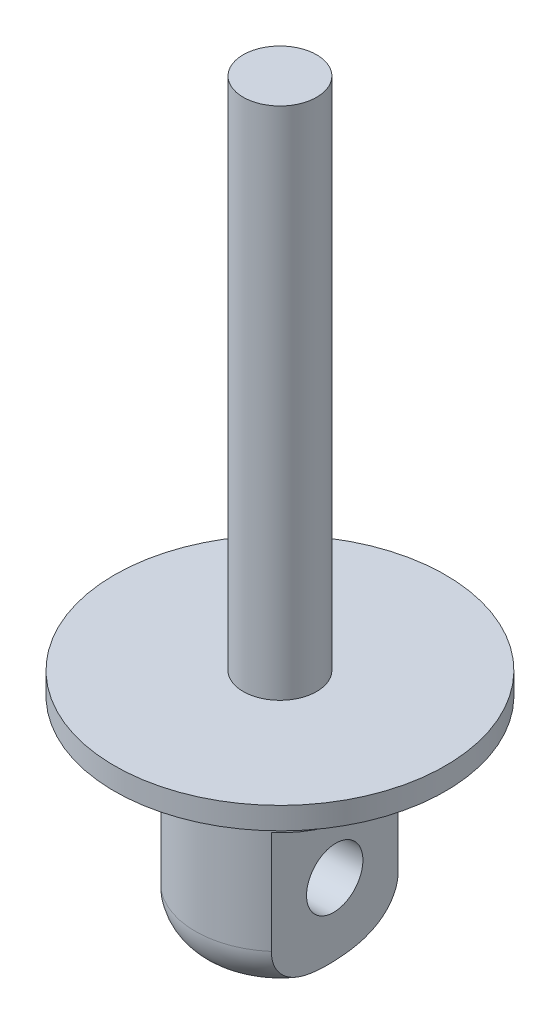
ISO-10303-21;
HEADER;
FILE_DESCRIPTION(('STEP AP214'),'2;1');
FILE_NAME('part.step','',(''),(''),'','','');
FILE_SCHEMA(('AUTOMOTIVE_DESIGN { 1 0 10303 214 1 1 1 1 }'));
ENDSEC;
DATA;
#1=APPLICATION_CONTEXT('core data for automotive mechanical design processes');
#2=APPLICATION_PROTOCOL_DEFINITION('international standard','automotive_design',2000,#1);
#3=PRODUCT_CONTEXT('',#1,'mechanical');
#4=PRODUCT('Part','Part','',(#3));
#5=PRODUCT_RELATED_PRODUCT_CATEGORY('part','',(#4));
#6=PRODUCT_DEFINITION_FORMATION('','',#4);
#7=PRODUCT_DEFINITION_CONTEXT('part definition',#1,'design');
#8=PRODUCT_DEFINITION('design','',#6,#7);
#9=PRODUCT_DEFINITION_SHAPE('','',#8);
#10=(LENGTH_UNIT() NAMED_UNIT(*) SI_UNIT(.MILLI.,.METRE.));
#11=(NAMED_UNIT(*) PLANE_ANGLE_UNIT() SI_UNIT($,.RADIAN.));
#12=(NAMED_UNIT(*) SI_UNIT($,.STERADIAN.) SOLID_ANGLE_UNIT());
#13=UNCERTAINTY_MEASURE_WITH_UNIT(LENGTH_MEASURE(1.E-05),#10,'distance_accuracy_value','');
#14=(GEOMETRIC_REPRESENTATION_CONTEXT(3) GLOBAL_UNCERTAINTY_ASSIGNED_CONTEXT((#13)) GLOBAL_UNIT_ASSIGNED_CONTEXT((#10,
#11,#12)) REPRESENTATION_CONTEXT('',''));
#15=CARTESIAN_POINT('',(0.,0.,0.));
#16=DIRECTION('',(0.,0.,1.));
#17=DIRECTION('',(1.,0.,0.));
#18=AXIS2_PLACEMENT_3D('',#15,#16,#17);
#19=CARTESIAN_POINT('',(0.,0.,0.));
#20=DIRECTION('',(0.,1.,0.));
#21=DIRECTION('',(-1.,0.,0.));
#22=AXIS2_PLACEMENT_3D('',#19,#20,#21);
#23=PLANE('',#22);
#24=CARTESIAN_POINT('',(0.,0.,0.));
#25=DIRECTION('',(0.,1.,0.));
#26=DIRECTION('',(-1.,0.,0.));
#27=AXIS2_PLACEMENT_3D('',#24,#25,#26);
#28=CIRCLE('',#27,5.5);
#29=CARTESIAN_POINT('',(-5.5,0.,0.));
#30=VERTEX_POINT('',#29);
#31=EDGE_CURVE('E123',#30,#30,#28,.F.);
#32=ORIENTED_EDGE('',*,*,#31,.T.);
#33=EDGE_LOOP('',(#32));
#34=FACE_BOUND('',#33,.T.);
#35=ADVANCED_FACE('F39',(#34),#23,.F.);
#36=CARTESIAN_POINT('',(0.,101.,0.));
#37=DIRECTION('',(0.,1.,0.));
#38=DIRECTION('',(-1.,0.,0.));
#39=AXIS2_PLACEMENT_3D('',#36,#37,#38);
#40=CYLINDRICAL_SURFACE('',#39,11.5);
#41=CARTESIAN_POINT('',(0.,6.00000000000001,0.));
#42=DIRECTION('',(0.,1.,0.));
#43=DIRECTION('',(-1.,0.,0.));
#44=AXIS2_PLACEMENT_3D('',#41,#42,#43);
#45=CIRCLE('',#44,11.5);
#46=CARTESIAN_POINT('',(6.79068463688067,6.00000000000001,-9.28098066814239));
#47=VERTEX_POINT('',#46);
#48=CARTESIAN_POINT('',(-7.16431353534802,6.00000000000001,-8.99569961521777));
#49=VERTEX_POINT('',#48);
#50=EDGE_CURVE('E121',#47,#49,#45,.T.);
#51=ORIENTED_EDGE('',*,*,#50,.T.);
#52=DIRECTION('',(0.,1.,0.));
#53=VECTOR('',#52,1.);
#54=CARTESIAN_POINT('',(-7.16431353534802,101.,-8.99569961521777));
#55=LINE('',#54,#53);
#56=CARTESIAN_POINT('',(-7.16431353534802,20.,-8.99569961521777));
#57=VERTEX_POINT('',#56);
#58=EDGE_CURVE('E56',#49,#57,#55,.T.);
#59=ORIENTED_EDGE('',*,*,#58,.T.);
#60=CARTESIAN_POINT('',(0.,20.,0.));
#61=DIRECTION('',(0.,-1.,0.));
#62=DIRECTION('',(1.,0.,0.));
#63=AXIS2_PLACEMENT_3D('',#60,#61,#62);
#64=CIRCLE('',#63,11.5);
#65=CARTESIAN_POINT('',(-7.16431353534802,20.,8.99569961521777));
#66=VERTEX_POINT('',#65);
#67=EDGE_CURVE('E11',#66,#57,#64,.T.);
#68=ORIENTED_EDGE('',*,*,#67,.F.);
#69=DIRECTION('',(0.,1.,0.));
#70=VECTOR('',#69,1.);
#71=CARTESIAN_POINT('',(-7.16431353534803,101.,8.99569961521777));
#72=LINE('',#71,#70);
#73=CARTESIAN_POINT('',(-7.16431353534802,6.00000000000118,8.99569961521845));
#74=VERTEX_POINT('',#73);
#75=EDGE_CURVE('E100',#66,#74,#72,.F.);
#76=ORIENTED_EDGE('',*,*,#75,.T.);
#77=CARTESIAN_POINT('',(7.52597118644042,6.00000000000001,8.69538715071782));
#78=VERTEX_POINT('',#77);
#79=EDGE_CURVE('E99',#74,#78,#45,.T.);
#80=ORIENTED_EDGE('',*,*,#79,.T.);
#81=DIRECTION('',(0.,1.,0.));
#82=VECTOR('',#81,1.);
#83=CARTESIAN_POINT('',(7.52597118644042,101.,8.69538715071782));
#84=LINE('',#83,#82);
#85=CARTESIAN_POINT('',(7.52597118644042,20.,8.69538715071782));
#86=VERTEX_POINT('',#85);
#87=EDGE_CURVE('E64',#78,#86,#84,.T.);
#88=ORIENTED_EDGE('',*,*,#87,.T.);
#89=CARTESIAN_POINT('',(0.,20.,0.));
#90=DIRECTION('',(0.,-1.,0.));
#91=DIRECTION('',(1.,0.,0.));
#92=AXIS2_PLACEMENT_3D('',#89,#90,#91);
#93=CIRCLE('',#92,11.5);
#94=CARTESIAN_POINT('',(6.79068463688067,20.,-9.28098066814239));
#95=VERTEX_POINT('',#94);
#96=EDGE_CURVE('E49',#95,#86,#93,.T.);
#97=ORIENTED_EDGE('',*,*,#96,.F.);
#98=DIRECTION('',(0.,1.,0.));
#99=VECTOR('',#98,1.);
#100=CARTESIAN_POINT('',(6.79068463688067,101.,-9.28098066814239));
#101=LINE('',#100,#99);
#102=EDGE_CURVE('E90',#95,#47,#101,.F.);
#103=ORIENTED_EDGE('',*,*,#102,.T.);
#104=EDGE_LOOP('',(#51,#59,#68,#76,#80,#88,#97,#103));
#105=FACE_BOUND('',#104,.T.);
#106=CARTESIAN_POINT('',(0.,28.,0.));
#107=DIRECTION('',(0.,1.,0.));
#108=DIRECTION('',(-1.,0.,0.));
#109=AXIS2_PLACEMENT_3D('',#106,#107,#108);
#110=CIRCLE('',#109,11.5);
#111=CARTESIAN_POINT('',(-11.5,28.,0.));
#112=VERTEX_POINT('',#111);
#113=EDGE_CURVE('E118',#112,#112,#110,.T.);
#114=ORIENTED_EDGE('',*,*,#113,.F.);
#115=EDGE_LOOP('',(#114));
#116=FACE_BOUND('',#115,.T.);
#117=ADVANCED_FACE('F95',(#105,#116),#40,.T.);
#118=CARTESIAN_POINT('',(11.5,28.,0.));
#119=DIRECTION('',(0.,1.,0.));
#120=DIRECTION('',(-1.,0.,0.));
#121=AXIS2_PLACEMENT_3D('',#118,#119,#120);
#122=PLANE('',#121);
#123=CARTESIAN_POINT('',(0.,28.,0.));
#124=DIRECTION('',(0.,1.,0.));
#125=DIRECTION('',(-1.,0.,0.));
#126=AXIS2_PLACEMENT_3D('',#123,#124,#125);
#127=CIRCLE('',#126,22.5);
#128=CARTESIAN_POINT('',(-22.5,28.,0.));
#129=VERTEX_POINT('',#128);
#130=EDGE_CURVE('E115',#129,#129,#127,.T.);
#131=ORIENTED_EDGE('',*,*,#130,.F.);
#132=EDGE_LOOP('',(#131));
#133=FACE_BOUND('',#132,.T.);
#134=ORIENTED_EDGE('',*,*,#113,.T.);
#135=EDGE_LOOP('',(#134));
#136=FACE_BOUND('',#135,.T.);
#137=ADVANCED_FACE('F162',(#133,#136),#122,.F.);
#138=CARTESIAN_POINT('',(0.,101.,0.));
#139=DIRECTION('',(0.,1.,0.));
#140=DIRECTION('',(-1.,0.,0.));
#141=AXIS2_PLACEMENT_3D('',#138,#139,#140);
#142=CYLINDRICAL_SURFACE('',#141,22.5);
#143=CARTESIAN_POINT('',(0.,31.,0.));
#144=DIRECTION('',(0.,1.,0.));
#145=DIRECTION('',(-1.,0.,0.));
#146=AXIS2_PLACEMENT_3D('',#143,#144,#145);
#147=CIRCLE('',#146,22.5);
#148=CARTESIAN_POINT('',(-22.5,31.,0.));
#149=VERTEX_POINT('',#148);
#150=EDGE_CURVE('E112',#149,#149,#147,.T.);
#151=ORIENTED_EDGE('',*,*,#150,.F.);
#152=EDGE_LOOP('',(#151));
#153=FACE_BOUND('',#152,.T.);
#154=ORIENTED_EDGE('',*,*,#130,.T.);
#155=EDGE_LOOP('',(#154));
#156=FACE_BOUND('',#155,.T.);
#157=ADVANCED_FACE('F158',(#153,#156),#142,.T.);
#158=CARTESIAN_POINT('',(22.5,31.,0.));
#159=DIRECTION('',(0.,-1.,0.));
#160=DIRECTION('',(1.,0.,0.));
#161=AXIS2_PLACEMENT_3D('',#158,#159,#160);
#162=PLANE('',#161);
#163=CARTESIAN_POINT('',(0.,31.,0.));
#164=DIRECTION('',(0.,1.,0.));
#165=DIRECTION('',(-1.,0.,0.));
#166=AXIS2_PLACEMENT_3D('',#163,#164,#165);
#167=CIRCLE('',#166,5.);
#168=CARTESIAN_POINT('',(-5.,31.,0.));
#169=VERTEX_POINT('',#168);
#170=EDGE_CURVE('E109',#169,#169,#167,.T.);
#171=ORIENTED_EDGE('',*,*,#170,.F.);
#172=EDGE_LOOP('',(#171));
#173=FACE_BOUND('',#172,.T.);
#174=ORIENTED_EDGE('',*,*,#150,.T.);
#175=EDGE_LOOP('',(#174));
#176=FACE_BOUND('',#175,.T.);
#177=ADVANCED_FACE('F154',(#173,#176),#162,.F.);
#178=CARTESIAN_POINT('',(0.,101.,0.));
#179=DIRECTION('',(0.,1.,0.));
#180=DIRECTION('',(-1.,0.,0.));
#181=AXIS2_PLACEMENT_3D('',#178,#179,#180);
#182=CYLINDRICAL_SURFACE('',#181,5.);
#183=CARTESIAN_POINT('',(0.,101.,0.));
#184=DIRECTION('',(0.,1.,0.));
#185=DIRECTION('',(-1.,0.,0.));
#186=AXIS2_PLACEMENT_3D('',#183,#184,#185);
#187=CIRCLE('',#186,5.);
#188=CARTESIAN_POINT('',(-5.,101.,0.));
#189=VERTEX_POINT('',#188);
#190=EDGE_CURVE('E106',#189,#189,#187,.T.);
#191=ORIENTED_EDGE('',*,*,#190,.F.);
#192=EDGE_LOOP('',(#191));
#193=FACE_BOUND('',#192,.T.);
#194=ORIENTED_EDGE('',*,*,#170,.T.);
#195=EDGE_LOOP('',(#194));
#196=FACE_BOUND('',#195,.T.);
#197=ADVANCED_FACE('F150',(#193,#196),#182,.T.);
#198=CARTESIAN_POINT('',(5.,101.,0.));
#199=DIRECTION('',(0.,-1.,0.));
#200=DIRECTION('',(1.,0.,0.));
#201=AXIS2_PLACEMENT_3D('',#198,#199,#200);
#202=PLANE('',#201);
#203=ORIENTED_EDGE('',*,*,#190,.T.);
#204=EDGE_LOOP('',(#203));
#205=FACE_BOUND('',#204,.T.);
#206=ADVANCED_FACE('F147',(#205),#202,.F.);
#207=CARTESIAN_POINT('',(0.,6.00000000000001,0.));
#208=DIRECTION('',(0.,1.,0.));
#209=DIRECTION('',(-1.,0.,0.));
#210=AXIS2_PLACEMENT_3D('',#207,#208,#209);
#211=DEGENERATE_TOROIDAL_SURFACE('',#210,5.5,6.,.T.);
#212=CARTESIAN_POINT('',(-7.16431353534802,0.235447939687133,0.));
#213=CARTESIAN_POINT('',(-7.16431353534802,0.235447385437466,0.181491533136056));
#214=CARTESIAN_POINT('',(-7.16431353534802,0.23742869346163,0.362983746875409));
#215=CARTESIAN_POINT('',(-7.16431353534802,0.245475154346559,0.725880113997458));
#216=CARTESIAN_POINT('',(-7.16431353534802,0.251540333582035,0.907284266803863));
#217=CARTESIAN_POINT('',(-7.16431353534802,0.268118020232585,1.26996799012435));
#218=CARTESIAN_POINT('',(-7.16431353534802,0.278632341374094,1.45124747959771));
#219=CARTESIAN_POINT('',(-7.16431353534802,0.304680550331587,1.81344970591921));
#220=CARTESIAN_POINT('',(-7.16431353534802,0.320214442367016,1.99437244246734));
#221=CARTESIAN_POINT('',(-7.16431353534802,0.356966363231156,2.35479167624498));
#222=CARTESIAN_POINT('',(-7.16431353534802,0.378157142833225,2.5342908710497));
#223=CARTESIAN_POINT('',(-7.16431353534802,0.427119188386968,2.89237794599804));
#224=CARTESIAN_POINT('',(-7.16431353534802,0.454890723675215,3.07096578853624));
#225=CARTESIAN_POINT('',(-7.16431353534802,0.549469182140893,3.60446596488215));
#226=CARTESIAN_POINT('',(-7.16431353534802,0.627581457208977,3.95757039707788));
#227=CARTESIAN_POINT('',(-7.16431353534802,0.775834743875251,4.48875396104387));
#228=CARTESIAN_POINT('',(-7.16431353534802,0.832300014805054,4.67069228400975));
#229=CARTESIAN_POINT('',(-7.16431353534802,0.956848351976338,5.03052555040747));
#230=CARTESIAN_POINT('',(-7.16431353534802,1.0249274368938,5.20842185587686));
#231=CARTESIAN_POINT('',(-7.16431353534802,1.17373125438983,5.55909121632505));
#232=CARTESIAN_POINT('',(-7.16431353534802,1.25446887709604,5.7318588331293));
#233=CARTESIAN_POINT('',(-7.16431353534802,1.42925025676239,6.07046753475876));
#234=CARTESIAN_POINT('',(-7.16431353534802,1.52328798021666,6.23631171641432));
#235=CARTESIAN_POINT('',(-7.16431353534802,1.72651877943088,6.56153147369497));
#236=CARTESIAN_POINT('',(-7.16431353534802,1.83589496222493,6.72079324457046));
#237=CARTESIAN_POINT('',(-7.16431353534802,2.0689448895318,7.02839097103782));
#238=CARTESIAN_POINT('',(-7.16431353534802,2.19261047974076,7.17673307962208));
#239=CARTESIAN_POINT('',(-7.16431353534802,2.45394010435715,7.4602966623001));
#240=CARTESIAN_POINT('',(-7.16431353534802,2.59158864400725,7.59553234192747));
#241=CARTESIAN_POINT('',(-7.16431353534802,2.88022257546079,7.85079414311618));
#242=CARTESIAN_POINT('',(-7.16431353534802,3.03120259547424,7.97082634373662));
#243=CARTESIAN_POINT('',(-7.16431353534802,3.41572240607048,8.24335534466075));
#244=CARTESIAN_POINT('',(-7.16431353534802,3.65605567979531,8.38646099725246));
#245=CARTESIAN_POINT('',(-7.16431353534802,4.1572090343419,8.6303675341194));
#246=CARTESIAN_POINT('',(-7.16431353534802,4.4180187857083,8.73118958782459));
#247=CARTESIAN_POINT('',(-7.16431353534802,4.95401771715259,8.88629598199798));
#248=CARTESIAN_POINT('',(-7.16431353534802,5.22924501268925,8.94044959895495));
#249=CARTESIAN_POINT('',(-7.16431353534802,5.78496311966398,8.99906960316239));
#250=CARTESIAN_POINT('',(-7.16431353534802,6.06545356225002,9.00353945942055));
#251=CARTESIAN_POINT('',(-7.16431353534802,6.60884633031526,8.96362522979109));
#252=CARTESIAN_POINT('',(-7.16431353534802,6.8719301139816,8.92165736558809));
#253=CARTESIAN_POINT('',(-7.16431353534802,7.38737416990948,8.79456934169308));
#254=CARTESIAN_POINT('',(-7.16431353534802,7.63973586248513,8.70945491689695));
#255=CARTESIAN_POINT('',(-7.16431353534802,8.12994286336459,8.49855003256806));
#256=CARTESIAN_POINT('',(-7.16431353534802,8.36760520889661,8.37233653564602));
#257=CARTESIAN_POINT('',(-7.16431353534802,8.82038173170156,8.08451113210159));
#258=CARTESIAN_POINT('',(-7.16431353534802,9.03548777706986,7.92288652364278));
#259=CARTESIAN_POINT('',(-7.16431353534802,9.45549671439815,7.55621948202331));
#260=CARTESIAN_POINT('',(-7.16431353534802,9.65828949594099,7.34877147399991));
#261=CARTESIAN_POINT('',(-7.16431353534802,10.0316637916763,6.90687485831092));
#262=CARTESIAN_POINT('',(-7.16431353534802,10.20224328937,6.67242456182436));
#263=CARTESIAN_POINT('',(-7.16431353534802,10.4730249195008,6.24423355588082));
#264=CARTESIAN_POINT('',(-7.16431353534802,10.5801901087915,6.05481229299179));
#265=CARTESIAN_POINT('',(-7.16431353534802,10.7772721256261,5.66712033210488));
#266=CARTESIAN_POINT('',(-7.16431353534802,10.8671811478653,5.46884567929057));
#267=CARTESIAN_POINT('',(-7.16431353534802,11.0310002099733,5.06537873875574));
#268=CARTESIAN_POINT('',(-7.16431353534802,11.1048765511754,4.86017290833698));
#269=CARTESIAN_POINT('',(-7.16431353534802,11.2379136118252,4.44499628803238));
#270=CARTESIAN_POINT('',(-7.16431353534802,11.2970681434875,4.23502353486677));
#271=CARTESIAN_POINT('',(-7.16431353534802,11.398755554638,3.82610383992846));
#272=CARTESIAN_POINT('',(-7.16431353534802,11.4421388005837,3.62736520690331));
#273=CARTESIAN_POINT('',(-7.16431353534802,11.518936312589,3.22802526364301));
#274=CARTESIAN_POINT('',(-7.16431353534802,11.5523520822801,3.02742423906925));
#275=CARTESIAN_POINT('',(-7.16431353534802,11.6106398137743,2.6247491097359));
#276=CARTESIAN_POINT('',(-7.16431353534802,11.6355010304291,2.42267347558179));
#277=CARTESIAN_POINT('',(-7.16431353534802,11.677889372671,2.01775837249206));
#278=CARTESIAN_POINT('',(-7.16431353534802,11.6954161180065,1.81491886450376));
#279=CARTESIAN_POINT('',(-7.16431353534802,11.7242542262342,1.40798412413948));
#280=CARTESIAN_POINT('',(-7.16431353534802,11.7355401791264,1.20388713013457));
#281=CARTESIAN_POINT('',(-7.16431353534802,11.7525759351435,0.795479435638228));
#282=CARTESIAN_POINT('',(-7.16431353534802,11.758326043797,0.591168747563914));
#283=CARTESIAN_POINT('',(-7.16431353534802,11.7647302227779,0.182587956579615));
#284=CARTESIAN_POINT('',(-7.16431353534802,11.7653872640604,-0.0216821004740007));
#285=CARTESIAN_POINT('',(-7.16431353534802,11.7616579544952,-0.430176665338991));
#286=CARTESIAN_POINT('',(-7.16431353534802,11.7572715456939,-0.63440117259999));
#287=CARTESIAN_POINT('',(-7.16431353534802,11.7396547677781,-1.14344656238087));
#288=CARTESIAN_POINT('',(-7.16431353534802,11.7231276636045,-1.4481629037706));
#289=CARTESIAN_POINT('',(-7.16431353534802,11.6755572442818,-2.05645893586162));
#290=CARTESIAN_POINT('',(-7.16431353534802,11.6445175764183,-2.36003889284599));
#291=CARTESIAN_POINT('',(-7.16431353534802,11.5841838938663,-2.81291693878126));
#292=CARTESIAN_POINT('',(-7.16431353534802,11.5618394576941,-2.96314184070143));
#293=CARTESIAN_POINT('',(-7.16431353534802,11.5120049649201,-3.26271376257647));
#294=CARTESIAN_POINT('',(-7.16431353534802,11.4845153732607,-3.41206086059742));
#295=CARTESIAN_POINT('',(-7.16431353534802,11.3934679228193,-3.85825349555144));
#296=CARTESIAN_POINT('',(-7.16431353534802,11.3213055413641,-4.15345715800239));
#297=CARTESIAN_POINT('',(-7.16431353534802,11.1798345773387,-4.63280630857077));
#298=CARTESIAN_POINT('',(-7.16431353534802,11.1185312944909,-4.81932855329792));
#299=CARTESIAN_POINT('',(-7.16431353534802,10.9832814162456,-5.18771745074792));
#300=CARTESIAN_POINT('',(-7.16431353534802,10.9093387390841,-5.36958552624404));
#301=CARTESIAN_POINT('',(-7.16431353534802,10.7478263673606,-5.72720446263923));
#302=CARTESIAN_POINT('',(-7.16431353534802,10.6602564145626,-5.90295520753806));
#303=CARTESIAN_POINT('',(-7.16431353534802,10.4707641468701,-6.24655829644649));
#304=CARTESIAN_POINT('',(-7.16431353534802,10.3688446568602,-6.4144121863938));
#305=CARTESIAN_POINT('',(-7.16431353534802,10.1702027494497,-6.71049652924636));
#306=CARTESIAN_POINT('',(-7.16431353534802,10.0759249918341,-6.84036864299017));
#307=CARTESIAN_POINT('',(-7.16431353534802,9.87745005614956,-7.09235977997643));
#308=CARTESIAN_POINT('',(-7.16431353534802,9.77325150498626,-7.21447772608764));
#309=CARTESIAN_POINT('',(-7.16431353534802,9.55512025398443,-7.44967839091494));
#310=CARTESIAN_POINT('',(-7.16431353534802,9.44118890789524,-7.5627623619599));
#311=CARTESIAN_POINT('',(-7.16431353534802,9.20396341092919,-7.77863502919202));
#312=CARTESIAN_POINT('',(-7.16431353534802,9.0806705480437,-7.88142513714977));
#313=CARTESIAN_POINT('',(-7.16431353534802,8.8243231203039,-8.07621490572432));
#314=CARTESIAN_POINT('',(-7.16431353534802,8.69120113592203,-8.16812606994532));
#315=CARTESIAN_POINT('',(-7.16431353534802,8.4169431732426,-8.33896771972691));
#316=CARTESIAN_POINT('',(-7.16431353534802,8.27581104010527,-8.41790436379917));
#317=CARTESIAN_POINT('',(-7.16431353534802,7.98657177878401,-8.5617107546654));
#318=CARTESIAN_POINT('',(-7.16431353534802,7.83846588879299,-8.62658298722294));
#319=CARTESIAN_POINT('',(-7.16431353534802,7.53654671091518,-8.74129459696838));
#320=CARTESIAN_POINT('',(-7.16431353534802,7.38273424741489,-8.7911361361064));
#321=CARTESIAN_POINT('',(-7.16431353534802,7.09038243776846,-8.86976609906792));
#322=CARTESIAN_POINT('',(-7.16431353534802,6.95233887820745,-8.9004079832714));
#323=CARTESIAN_POINT('',(-7.16431353534802,6.67406773175886,-8.9492206879905));
#324=CARTESIAN_POINT('',(-7.16431353534802,6.53384034417802,-8.96739263983008));
#325=CARTESIAN_POINT('',(-7.16431353534802,6.25237333567887,-8.99103390570626));
#326=CARTESIAN_POINT('',(-7.16431353534802,6.11113412109898,-8.99650806046049));
#327=CARTESIAN_POINT('',(-7.16431353534802,5.8287378130908,-8.99469859065023));
#328=CARTESIAN_POINT('',(-7.16431353534802,5.68758071782573,-8.9874152633463));
#329=CARTESIAN_POINT('',(-7.16431353534802,5.41510706714754,-8.96101956781087));
#330=CARTESIAN_POINT('',(-7.16431353534802,5.2837170186452,-8.94265850596696));
#331=CARTESIAN_POINT('',(-7.16431353534802,5.02289842867066,-8.89497273577228));
#332=CARTESIAN_POINT('',(-7.16431353534802,4.89347053172236,-8.86564450280155));
#333=CARTESIAN_POINT('',(-7.16431353534802,4.63756174204751,-8.7963600511725));
#334=CARTESIAN_POINT('',(-7.16431353534802,4.51107947467129,-8.75640890261238));
#335=CARTESIAN_POINT('',(-7.16431353534802,4.26176585926293,-8.66628087540806));
#336=CARTESIAN_POINT('',(-7.16431353534802,4.13893590041353,-8.61610016146906));
#337=CARTESIAN_POINT('',(-7.16431353534802,3.8959444879985,-8.50522697244006));
#338=CARTESIAN_POINT('',(-7.16431353534802,3.7758480812018,-8.44439186082342));
#339=CARTESIAN_POINT('',(-7.16431353534802,3.54086616831137,-8.31334588199134));
#340=CARTESIAN_POINT('',(-7.16431353534802,3.42598255125706,-8.24313165170298));
#341=CARTESIAN_POINT('',(-7.16431353534802,3.09008987290001,-8.01943070900894));
#342=CARTESIAN_POINT('',(-7.16431353534802,2.87767005979279,-7.8528076878874));
#343=CARTESIAN_POINT('',(-7.16431353534802,2.46294682270087,-7.47564860292608));
#344=CARTESIAN_POINT('',(-7.16431353534802,2.26293630171616,-7.26261925849268));
#345=CARTESIAN_POINT('',(-7.16431353534802,1.89561646384311,-6.81009370640971));
#346=CARTESIAN_POINT('',(-7.16431353534802,1.72831789617765,-6.57058883917637));
#347=CARTESIAN_POINT('',(-7.16431353534802,1.46175526259968,-6.1311296182884));
#348=CARTESIAN_POINT('',(-7.16431353534802,1.35575306584162,-5.93518181859578));
#349=CARTESIAN_POINT('',(-7.16431353534802,1.16159753101357,-5.53455580746181));
#350=CARTESIAN_POINT('',(-7.16431353534802,1.07345243066623,-5.3298736191984));
#351=CARTESIAN_POINT('',(-7.16431353534802,0.913637776442995,-4.91388049225675));
#352=CARTESIAN_POINT('',(-7.16431353534802,0.841993844213501,-4.70255981630851));
#353=CARTESIAN_POINT('',(-7.16431353534802,0.713673352689305,-4.27539497429056));
#354=CARTESIAN_POINT('',(-7.16431353534802,0.657002251003379,-4.05954918967177));
#355=CARTESIAN_POINT('',(-7.16431353534802,0.534666060627862,-3.52868407160688));
#356=CARTESIAN_POINT('',(-7.16431353534802,0.476113772416793,-3.21203565818064));
#357=CARTESIAN_POINT('',(-7.16431353534802,0.380814152456521,-2.57546372196236));
#358=CARTESIAN_POINT('',(-7.16431353534802,0.344078082586474,-2.25553859420684));
#359=CARTESIAN_POINT('',(-7.16431353534802,0.30166577370918,-1.77408585021101));
#360=CARTESIAN_POINT('',(-7.16431353534802,0.289634376947914,-1.61307528362636));
#361=CARTESIAN_POINT('',(-7.16431353534802,0.269379560597742,-1.29081455353211));
#362=CARTESIAN_POINT('',(-7.16431353534802,0.261156074713451,-1.12956439424283));
#363=CARTESIAN_POINT('',(-7.16431353534802,0.248150357286316,-0.806958011139428));
#364=CARTESIAN_POINT('',(-7.16431353534802,0.243367511249777,-0.645601811419018));
#365=CARTESIAN_POINT('',(-7.16431353534802,0.237016584347217,-0.322830586335497));
#366=CARTESIAN_POINT('',(-7.16431353534802,0.235448432627603,-0.161415562347334));
#367=CARTESIAN_POINT('',(-7.16431353534802,0.235447939687133,0.));
#368=B_SPLINE_CURVE_WITH_KNOTS('',3,(#212,#213,#214,#215,#216,#217,#218,#219,#220,#221,#222,
#223,#224,#225,#226,#227,#228,#229,#230,#231,#232,#233,#234,#235,#236,#237,#238,#239,#240,#241,
#242,#243,#244,#245,#246,#247,#248,#249,#250,#251,#252,#253,#254,#255,#256,#257,#258,#259,#260,
#261,#262,#263,#264,#265,#266,#267,#268,#269,#270,#271,#272,#273,#274,#275,#276,#277,#278,#279,
#280,#281,#282,#283,#284,#285,#286,#287,#288,#289,#290,#291,#292,#293,#294,#295,#296,#297,#298,
#299,#300,#301,#302,#303,#304,#305,#306,#307,#308,#309,#310,#311,#312,#313,#314,#315,#316,#317,
#318,#319,#320,#321,#322,#323,#324,#325,#326,#327,#328,#329,#330,#331,#332,#333,#334,#335,#336,
#337,#338,#339,#340,#341,#342,#343,#344,#345,#346,#347,#348,#349,#350,#351,#352,#353,#354,#355,
#356,#357,#358,#359,#360,#361,#362,#363,#364,#365,#366,#367),.UNSPECIFIED.,.T.,.F.,(4,2,2,2,2,2,
2,2,2,2,2,2,2,2,2,2,2,2,2,2,2,2,2,2,2,2,2,2,2,2,2,2,2,2,2,2,2,2,2,2,2,2,2,2,2,2,2,2,2,2,2,2,2,2,
2,2,2,2,2,2,2,2,2,2,2,2,2,2,2,2,2,2,2,2,2,2,2,4),(0.,0.544464449306331,1.0889324149404,
1.63362255122444,2.17831314537551,2.72042588446775,3.26256081493455,4.34546196893951,
4.91664119834856,5.48762501421211,6.05919408229474,6.6305046884539,7.20933142540787,
7.78782946898906,8.36569332006232,8.94332537990972,9.7785351396075,10.6133262480286,
11.450448169105,12.2875116404871,13.0829865149816,13.8783556853407,14.6821851309487,
15.4863033806728,16.3532449460675,17.2202407626045,17.8722698845528,18.524593240656,
19.1782746963236,19.8322304413083,20.4422008385135,21.0520791727966,21.662720786447,
22.2733940545484,22.8865357673916,23.4996436384011,24.1123938363026,24.7251510752737,
25.6403741251082,26.5553672853633,27.0109164517383,27.4664244722302,28.3768166885084,
28.9654505855983,29.5539023349109,30.1423652367013,30.7307124538162,31.2117126051947,
31.6927794267792,32.173779444651,32.6547134042972,33.1393239388263,33.6237037786881,
34.1079979386687,34.5922224066056,35.0158852718248,35.4395096955088,35.8629725964132,
36.2864256303907,36.6839603487719,37.0816229364711,37.4790960676532,37.8767184954625,
38.2801401164505,38.6837067826903,39.4902880437004,40.3636355278285,41.2372695154174,
41.9047138520098,42.5724653921678,43.2412468749535,43.9102717938647,44.8752765764408,
45.8407790778015,46.3251223664607,46.8094572224297,47.293705555348,47.7779432150576),.UNSPECIFIED.);
#369=EDGE_CURVE('E87',#49,#74,#368,.T.);
#370=ORIENTED_EDGE('',*,*,#369,.F.);
#371=ORIENTED_EDGE('',*,*,#50,.F.);
#372=CARTESIAN_POINT('',(7.52597118626627,6.0002,8.69538714646008));
#373=CARTESIAN_POINT('',(7.52597248742701,5.86230001302887,8.69541895738338));
#374=CARTESIAN_POINT('',(7.52572333282544,5.72440781564216,8.68932759781188));
#375=CARTESIAN_POINT('',(7.52473190823925,5.44972511554161,8.6650891386197));
#376=CARTESIAN_POINT('',(7.52398977172153,5.31293432478202,8.64694530201296));
#377=CARTESIAN_POINT('',(7.52202406018518,5.04200071280883,8.59888736647145));
#378=CARTESIAN_POINT('',(7.52080239763859,4.90784956893259,8.56902002386722));
#379=CARTESIAN_POINT('',(7.51789213238698,4.64261531620105,8.49786953342967));
#380=CARTESIAN_POINT('',(7.51620351691006,4.51153229137004,8.45658607334752));
#381=CARTESIAN_POINT('',(7.51237996235273,4.25344311361428,8.36310738379537));
#382=CARTESIAN_POINT('',(7.51024536645261,4.1264339120807,8.31092054443568));
#383=CARTESIAN_POINT('',(7.50555163598325,3.8771508970323,8.19616769684145));
#384=CARTESIAN_POINT('',(7.50299233898037,3.75487891749852,8.13359771741079));
#385=CARTESIAN_POINT('',(7.49747634346094,3.51581215695569,7.99874204188718));
#386=CARTESIAN_POINT('',(7.49451959179049,3.39901811136557,7.92645504628117));
#387=CARTESIAN_POINT('',(7.48823740191234,3.17147362045055,7.7728673653628));
#388=CARTESIAN_POINT('',(7.48491182593279,3.06072545673246,7.69156331178813));
#389=CARTESIAN_POINT('',(7.47780151567229,2.84201467789877,7.51772965112143));
#390=CARTESIAN_POINT('',(7.4740047631842,2.73428622662628,7.42490622155672));
#391=CARTESIAN_POINT('',(7.46608515139464,2.52620232626834,7.23128666657228));
#392=CARTESIAN_POINT('',(7.46196216604259,2.42584975626469,7.13048745945412));
#393=CARTESIAN_POINT('',(7.45342716585144,2.23280439751209,6.92182281998527));
#394=CARTESIAN_POINT('',(7.44901514598233,2.14011174213041,6.81395726466052));
#395=CARTESIAN_POINT('',(7.43993695327578,1.96248922795767,6.5920125938092));
#396=CARTESIAN_POINT('',(7.43527072814072,1.87756097623446,6.4779321997048));
#397=CARTESIAN_POINT('',(7.42353388981518,1.67841601081936,6.19098866334225));
#398=CARTESIAN_POINT('',(7.41633917390523,1.56855596714217,6.01509144391563));
#399=CARTESIAN_POINT('',(7.40157902662615,1.36491448378602,5.65423371204458));
#400=CARTESIAN_POINT('',(7.39401345119571,1.27113935700065,5.46926967757344));
#401=CARTESIAN_POINT('',(7.37859545377025,1.09882125863757,5.09232875173138));
#402=CARTESIAN_POINT('',(7.37074290811495,1.02028494792898,4.90034883710009));
#403=CARTESIAN_POINT('',(7.35482413614809,0.877322588622236,4.51116491924908));
#404=CARTESIAN_POINT('',(7.34675780056869,0.812903917741998,4.31395824463694));
#405=CARTESIAN_POINT('',(7.32443911726661,0.653853584410808,3.76830857851557));
#406=CARTESIAN_POINT('',(7.31003109255367,0.572194827420425,3.41605957853299));
#407=CARTESIAN_POINT('',(7.28825224891788,0.4729388615162,2.88360797296392));
#408=CARTESIAN_POINT('',(7.28096166943846,0.443718023133165,2.70536707026657));
#409=CARTESIAN_POINT('',(7.26634041434059,0.392047711374925,2.34790498997966));
#410=CARTESIAN_POINT('',(7.25900974227232,0.369597648028748,2.16868389918504));
#411=CARTESIAN_POINT('',(7.24426268164228,0.33042224968979,1.80814611117396));
#412=CARTESIAN_POINT('',(7.23684608364112,0.313745458798628,1.62682429355969));
#413=CARTESIAN_POINT('',(7.22199677122017,0.285583763339533,1.26378664232564));
#414=CARTESIAN_POINT('',(7.21456405709372,0.274098765057773,1.08207081587736));
#415=CARTESIAN_POINT('',(7.199692625132,0.255707414753552,0.718492383636223));
#416=CARTESIAN_POINT('',(7.19225391134173,0.248799063344394,0.536629876735618));
#417=CARTESIAN_POINT('',(7.17737105248988,0.239147141050938,0.172772078606205));
#418=CARTESIAN_POINT('',(7.1699269068168,0.236404149554531,-0.00922322757276414));
#419=CARTESIAN_POINT('',(7.15354099627595,0.234757846970255,-0.409827801538855));
#420=CARTESIAN_POINT('',(7.14459906221403,0.236737466164964,-0.628441205803039));
#421=CARTESIAN_POINT('',(7.12672067292513,0.24662401991241,-1.06553406716246));
#422=CARTESIAN_POINT('',(7.11778421763299,0.254530882566733,-1.2840135258503));
#423=CARTESIAN_POINT('',(7.09991647254434,0.276962857318707,-1.72084615661106));
#424=CARTESIAN_POINT('',(7.09098519516583,0.291494082602533,-1.93919902508734));
#425=CARTESIAN_POINT('',(7.07314889707794,0.328289964962507,-2.37526283605555));
#426=CARTESIAN_POINT('',(7.06424387610604,0.350554544449479,-2.59297378496579));
#427=CARTESIAN_POINT('',(7.04657261688327,0.403990539876038,-3.02500270729701));
#428=CARTESIAN_POINT('',(7.03780590670359,0.435065305617878,-3.23933221848637));
#429=CARTESIAN_POINT('',(7.02034694943037,0.507811003630579,-3.66617075900523));
#430=CARTESIAN_POINT('',(7.01165470553256,0.549482388326594,-3.87867971020496));
#431=CARTESIAN_POINT('',(6.98578315647448,0.69279443597465,-4.51119023578206));
#432=CARTESIAN_POINT('',(6.96875885209229,0.81286421405394,-4.92740233379685));
#433=CARTESIAN_POINT('',(6.93934037854133,1.08126596500859,-5.64662846616399));
#434=CARTESIAN_POINT('',(6.92676223303697,1.21727103549459,-5.95414037454985));
#435=CARTESIAN_POINT('',(6.90856244101484,1.45256570686409,-6.39909092588605));
#436=CARTESIAN_POINT('',(6.90260204382848,1.53630081768841,-6.54481138307723));
#437=CARTESIAN_POINT('',(6.89095659739178,1.71449966164083,-6.82952056031763));
#438=CARTESIAN_POINT('',(6.88527144811506,1.80895945498702,-6.96851172582257));
#439=CARTESIAN_POINT('',(6.87418217844653,2.00960455354203,-7.23962343121591));
#440=CARTESIAN_POINT('',(6.86878084639547,2.11588240172366,-7.37167580143772));
#441=CARTESIAN_POINT('',(6.85837251320987,2.339356596219,-7.6261398955215));
#442=CARTESIAN_POINT('',(6.85336533865202,2.45654809058483,-7.74855585925558));
#443=CARTESIAN_POINT('',(6.84380291817969,2.70154747423025,-7.98233898469457));
#444=CARTESIAN_POINT('',(6.83924772351885,2.82935656451267,-8.0937048933443));
#445=CARTESIAN_POINT('',(6.8306510607661,3.09493911348052,-8.30387706601726));
#446=CARTESIAN_POINT('',(6.82660953703072,3.23271149035068,-8.40268469041807));
#447=CARTESIAN_POINT('',(6.81931304481281,3.50917408382287,-8.58107014840728));
#448=CARTESIAN_POINT('',(6.81602633633991,3.64736245596853,-8.66142396483116));
#449=CARTESIAN_POINT('',(6.81000692460655,3.93077598265553,-8.8085872162695));
#450=CARTESIAN_POINT('',(6.80727413857586,4.07600008185453,-8.8753986748598));
#451=CARTESIAN_POINT('',(6.80240551637897,4.37208240542352,-8.99442729497357));
#452=CARTESIAN_POINT('',(6.8002688119738,4.52293206851404,-9.04666568330054));
#453=CARTESIAN_POINT('',(6.79662035685331,4.82901506413674,-9.13586352223256));
#454=CARTESIAN_POINT('',(6.79510826280628,4.98424593816597,-9.17283136664976));
#455=CARTESIAN_POINT('',(6.79284526676065,5.28263805984209,-9.22815734713073));
#456=CARTESIAN_POINT('',(6.79203537194086,5.42553286828566,-9.24795774628649));
#457=CARTESIAN_POINT('',(6.79095469136391,5.71234692148439,-9.27437834592569));
#458=CARTESIAN_POINT('',(6.79068319949397,5.85626457569774,-9.28101580953312));
#459=CARTESIAN_POINT('',(6.79068463705482,6.0002,-9.28098066388466));
#460=B_SPLINE_CURVE_WITH_KNOTS('',3,(#372,#373,#374,#375,#376,#377,#378,#379,#380,#381,#382,
#383,#384,#385,#386,#387,#388,#389,#390,#391,#392,#393,#394,#395,#396,#397,#398,#399,#400,#401,
#402,#403,#404,#405,#406,#407,#408,#409,#410,#411,#412,#413,#414,#415,#416,#417,#418,#419,#420,
#421,#422,#423,#424,#425,#426,#427,#428,#429,#430,#431,#432,#433,#434,#435,#436,#437,#438,#439,
#440,#441,#442,#443,#444,#445,#446,#447,#448,#449,#450,#451,#452,#453,#454,#455,#456,#457,#458,
#459),.UNSPECIFIED.,.F.,.F.,(4,2,2,2,2,2,2,2,2,2,2,2,2,2,2,2,2,2,2,2,2,2,2,2,2,2,2,2,2,2,2,2,2,
2,2,2,2,2,2,2,2,2,2,4),(0.,0.413552603118418,0.82699328914101,1.23880155405063,1.65062108368066,
2.06212487919071,2.47378642511764,2.88550307981,3.29737404985227,3.72369967213782,
4.15019083106493,4.57668941409387,5.00327607442325,5.62485092928636,6.24666917998721,
6.86875861747497,7.49117238068319,8.57469614102473,9.11692350227311,9.65910360292197,
10.2057377476353,10.7523620250009,11.2987473424206,11.8452086532849,12.5015457173887,
13.1578748201474,13.8148108355793,14.4717402601257,15.1217247197269,15.7717369352292,
17.0680748443666,18.0744827699442,18.5785903892447,19.0825134168871,19.5907048974255,
20.0986715169589,20.6066956732641,21.1146647508066,21.5936214315965,22.0725064911201,
22.5506903315664,23.0286109761736,23.4607994365477,23.8924207080835),.UNSPECIFIED.);
#461=EDGE_CURVE('E126',#78,#47,#460,.T.);
#462=ORIENTED_EDGE('',*,*,#461,.F.);
#463=ORIENTED_EDGE('',*,*,#79,.F.);
#464=EDGE_LOOP('',(#370,#371,#462,#463));
#465=FACE_BOUND('',#464,.T.);
#466=ORIENTED_EDGE('',*,*,#31,.F.);
#467=EDGE_LOOP('',(#466));
#468=FACE_BOUND('',#467,.T.);
#469=ADVANCED_FACE('F41',(#465,#468),#211,.T.);
#470=CARTESIAN_POINT('',(0.,20.,0.));
#471=DIRECTION('',(0.,-1.,0.));
#472=DIRECTION('',(1.,0.,0.));
#473=AXIS2_PLACEMENT_3D('',#470,#471,#472);
#474=PLANE('',#473);
#475=ORIENTED_EDGE('',*,*,#96,.T.);
#476=DIRECTION('',(-0.0408687806958276,0.,-0.999164522370784));
#477=VECTOR('',#476,1.);
#478=CARTESIAN_POINT('',(7.83568646465198,20.,16.2673409197417));
#479=LINE('',#478,#477);
#480=EDGE_CURVE('E84',#86,#95,#479,.T.);
#481=ORIENTED_EDGE('',*,*,#480,.T.);
#482=EDGE_LOOP('',(#475,#481));
#483=FACE_BOUND('',#482,.T.);
#484=ADVANCED_FACE('F83',(#483),#474,.T.);
#485=CARTESIAN_POINT('',(7.83568646465198,20.,16.2673409197417));
#486=DIRECTION('',(-0.999164522370784,0.,0.0408687806958276));
#487=DIRECTION('',(0.0408687806958276,0.,0.999164522370784));
#488=AXIS2_PLACEMENT_3D('',#485,#486,#487);
#489=PLANE('',#488);
#490=CARTESIAN_POINT('',(7.15832791166054,10.,-0.292796758712287));
#491=DIRECTION('',(0.999164522370784,0.,-0.0408687806958276));
#492=DIRECTION('',(-0.0408687806958276,0.,-0.999164522370784));
#493=AXIS2_PLACEMENT_3D('',#490,#491,#492);
#494=CIRCLE('',#493,4.);
#495=CARTESIAN_POINT('',(6.99485278887723,10.,-4.28945484819542));
#496=VERTEX_POINT('',#495);
#497=EDGE_CURVE('E184',#496,#496,#494,.T.);
#498=ORIENTED_EDGE('',*,*,#497,.F.);
#499=EDGE_LOOP('',(#498));
#500=FACE_BOUND('',#499,.T.);
#501=ORIENTED_EDGE('',*,*,#461,.T.);
#502=ORIENTED_EDGE('',*,*,#102,.F.);
#503=ORIENTED_EDGE('',*,*,#480,.F.);
#504=ORIENTED_EDGE('',*,*,#87,.F.);
#505=EDGE_LOOP('',(#501,#502,#503,#504));
#506=FACE_BOUND('',#505,.T.);
#507=ADVANCED_FACE('F89',(#500,#506),#489,.F.);
#508=CARTESIAN_POINT('',(0.,20.,0.));
#509=DIRECTION('',(0.,-1.,0.));
#510=DIRECTION('',(1.,0.,0.));
#511=AXIS2_PLACEMENT_3D('',#508,#509,#510);
#512=PLANE('',#511);
#513=ORIENTED_EDGE('',*,*,#67,.T.);
#514=DIRECTION('',(0.,0.,1.));
#515=VECTOR('',#514,1.);
#516=CARTESIAN_POINT('',(-7.16431353534803,20.,16.5739848720416));
#517=LINE('',#516,#515);
#518=EDGE_CURVE('E91',#57,#66,#517,.T.);
#519=ORIENTED_EDGE('',*,*,#518,.T.);
#520=EDGE_LOOP('',(#513,#519));
#521=FACE_BOUND('',#520,.T.);
#522=ADVANCED_FACE('F140',(#521),#512,.T.);
#523=CARTESIAN_POINT('',(-7.16431353534803,20.,16.5739848720416));
#524=DIRECTION('',(1.,0.,0.));
#525=DIRECTION('',(0.,0.,-1.));
#526=AXIS2_PLACEMENT_3D('',#523,#524,#525);
#527=PLANE('',#526);
#528=CARTESIAN_POINT('',(-7.16431353534802,10.,0.293041588403829));
#529=DIRECTION('',(1.,0.,0.));
#530=DIRECTION('',(0.,0.,-1.));
#531=AXIS2_PLACEMENT_3D('',#528,#529,#530);
#532=ELLIPSE('',#531,4.00334470494302,4.);
#533=CARTESIAN_POINT('',(-7.16431353534802,10.,-3.71030311653919));
#534=VERTEX_POINT('',#533);
#535=EDGE_CURVE('E44',#534,#534,#532,.T.);
#536=ORIENTED_EDGE('',*,*,#535,.T.);
#537=EDGE_LOOP('',(#536));
#538=FACE_BOUND('',#537,.T.);
#539=ORIENTED_EDGE('',*,*,#369,.T.);
#540=ORIENTED_EDGE('',*,*,#75,.F.);
#541=ORIENTED_EDGE('',*,*,#518,.F.);
#542=ORIENTED_EDGE('',*,*,#58,.F.);
#543=EDGE_LOOP('',(#539,#540,#541,#542));
#544=FACE_BOUND('',#543,.T.);
#545=ADVANCED_FACE('F142',(#538,#544),#527,.F.);
#546=CARTESIAN_POINT('',(-23.3811985164358,10.,0.956360092036198));
#547=DIRECTION('',(0.999164522370784,0.,-0.0408687806958276));
#548=DIRECTION('',(-0.0408687806958276,0.,-0.999164522370784));
#549=AXIS2_PLACEMENT_3D('',#546,#547,#548);
#550=CYLINDRICAL_SURFACE('',#549,4.);
#551=ORIENTED_EDGE('',*,*,#497,.T.);
#552=EDGE_LOOP('',(#551));
#553=FACE_BOUND('',#552,.T.);
#554=ORIENTED_EDGE('',*,*,#535,.F.);
#555=EDGE_LOOP('',(#554));
#556=FACE_BOUND('',#555,.T.);
#557=ADVANCED_FACE('F192',(#553,#556),#550,.F.);
#558=CLOSED_SHELL('',(#35,#117,#137,#157,#177,#197,#206,#469,#484,#507,#522,#545,#557));
#559=MANIFOLD_SOLID_BREP('B2',#558);
#560=ADVANCED_BREP_SHAPE_REPRESENTATION('',(#18,#559),#14);
#561=SHAPE_DEFINITION_REPRESENTATION(#9,#560);
ENDSEC;
END-ISO-10303-21;
